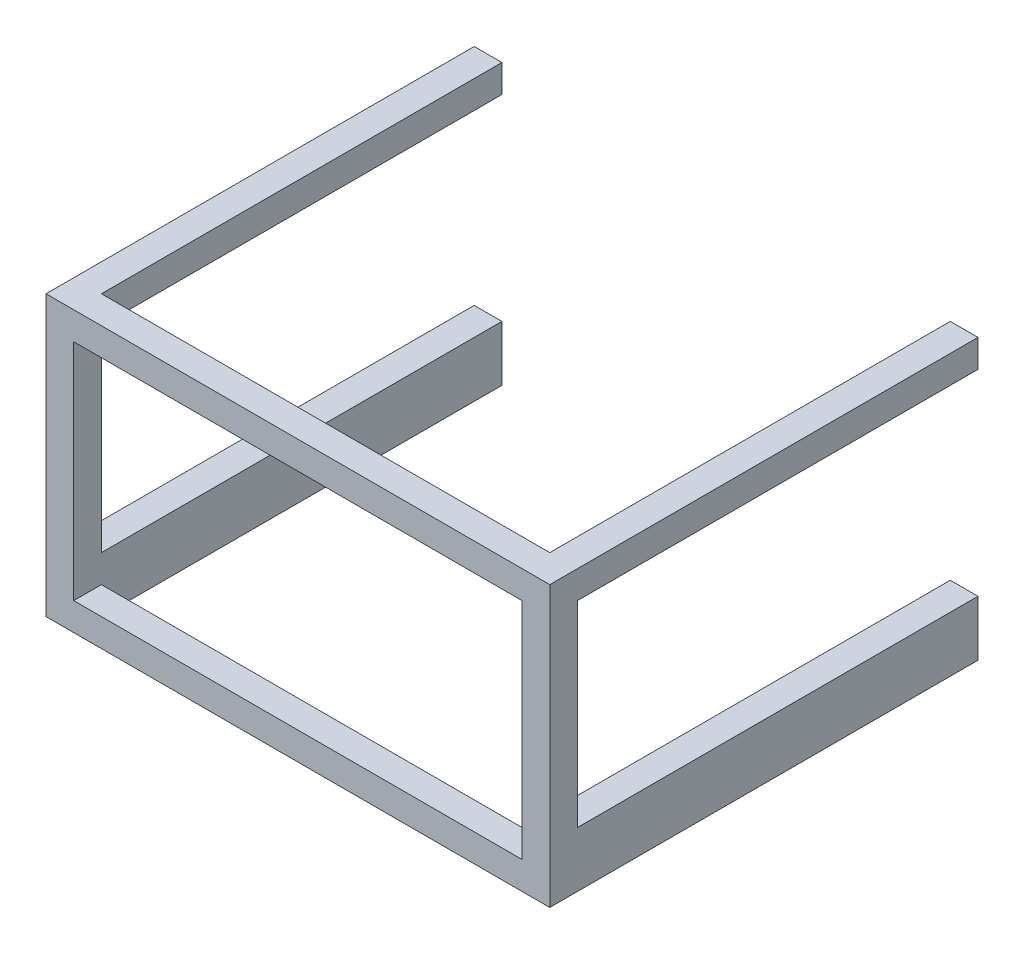
ISO-10303-21;
HEADER;
FILE_DESCRIPTION(('STEP AP214'),'2;1');
FILE_NAME('part.step','',(''),(''),'','','');
FILE_SCHEMA(('AUTOMOTIVE_DESIGN { 1 0 10303 214 1 1 1 1 }'));
ENDSEC;
DATA;
#1=APPLICATION_CONTEXT('core data for automotive mechanical design processes');
#2=APPLICATION_PROTOCOL_DEFINITION('international standard','automotive_design',2000,#1);
#3=PRODUCT_CONTEXT('',#1,'mechanical');
#4=PRODUCT('Part','Part','',(#3));
#5=PRODUCT_RELATED_PRODUCT_CATEGORY('part','',(#4));
#6=PRODUCT_DEFINITION_FORMATION('','',#4);
#7=PRODUCT_DEFINITION_CONTEXT('part definition',#1,'design');
#8=PRODUCT_DEFINITION('design','',#6,#7);
#9=PRODUCT_DEFINITION_SHAPE('','',#8);
#10=(LENGTH_UNIT() NAMED_UNIT(*) SI_UNIT(.MILLI.,.METRE.));
#11=(NAMED_UNIT(*) PLANE_ANGLE_UNIT() SI_UNIT($,.RADIAN.));
#12=(NAMED_UNIT(*) SI_UNIT($,.STERADIAN.) SOLID_ANGLE_UNIT());
#13=UNCERTAINTY_MEASURE_WITH_UNIT(LENGTH_MEASURE(1.E-05),#10,'distance_accuracy_value','');
#14=(GEOMETRIC_REPRESENTATION_CONTEXT(3) GLOBAL_UNCERTAINTY_ASSIGNED_CONTEXT((#13)) GLOBAL_UNIT_ASSIGNED_CONTEXT((#10,
#11,#12)) REPRESENTATION_CONTEXT('',''));
#15=CARTESIAN_POINT('',(0.,0.,0.));
#16=DIRECTION('',(0.,0.,1.));
#17=DIRECTION('',(1.,0.,0.));
#18=AXIS2_PLACEMENT_3D('',#15,#16,#17);
#19=CARTESIAN_POINT('',(-158.07662835249,91.5708812260537,318.));
#20=DIRECTION('',(0.,0.,1.));
#21=DIRECTION('',(1.,0.,0.));
#22=AXIS2_PLACEMENT_3D('',#19,#20,#21);
#23=PLANE('',#22);
#24=DIRECTION('',(1.,0.,0.));
#25=VECTOR('',#24,1.);
#26=CARTESIAN_POINT('',(-180.07662835249,69.5708812260536,318.));
#27=LINE('',#26,#25);
#28=CARTESIAN_POINT('',(-180.07662835249,69.5708812260536,318.));
#29=VERTEX_POINT('',#28);
#30=CARTESIAN_POINT('',(-158.07662835249,69.5708812260536,318.));
#31=VERTEX_POINT('',#30);
#32=EDGE_CURVE('E217',#29,#31,#27,.T.);
#33=ORIENTED_EDGE('',*,*,#32,.T.);
#34=DIRECTION('',(0.,-1.,0.));
#35=VECTOR('',#34,1.);
#36=CARTESIAN_POINT('',(-158.07662835249,91.5708812260537,318.));
#37=LINE('',#36,#35);
#38=CARTESIAN_POINT('',(-158.07662835249,-86.4291187739464,318.));
#39=VERTEX_POINT('',#38);
#40=EDGE_CURVE('E190',#31,#39,#37,.T.);
#41=ORIENTED_EDGE('',*,*,#40,.T.);
#42=DIRECTION('',(1.,0.,0.));
#43=VECTOR('',#42,1.);
#44=CARTESIAN_POINT('',(-180.07662835249,-86.4291187739464,318.));
#45=LINE('',#44,#43);
#46=CARTESIAN_POINT('',(-180.07662835249,-86.4291187739464,318.));
#47=VERTEX_POINT('',#46);
#48=EDGE_CURVE('E229',#47,#39,#45,.T.);
#49=ORIENTED_EDGE('',*,*,#48,.F.);
#50=DIRECTION('',(0.,-1.,0.));
#51=VECTOR('',#50,1.);
#52=CARTESIAN_POINT('',(-180.07662835249,69.5708812260536,318.));
#53=LINE('',#52,#51);
#54=EDGE_CURVE('E200',#29,#47,#53,.T.);
#55=ORIENTED_EDGE('',*,*,#54,.F.);
#56=EDGE_LOOP('',(#33,#41,#49,#55));
#57=FACE_BOUND('',#56,.T.);
#58=ADVANCED_FACE('F33',(#57),#23,.F.);
#59=DIRECTION('',(0.,-1.,0.));
#60=VECTOR('',#59,1.);
#61=CARTESIAN_POINT('',(197.92337164751,91.5708812260537,318.));
#62=LINE('',#61,#60);
#63=CARTESIAN_POINT('',(197.92337164751,91.5708812260537,318.));
#64=VERTEX_POINT('',#63);
#65=CARTESIAN_POINT('',(197.92337164751,69.5708812260536,318.));
#66=VERTEX_POINT('',#65);
#67=EDGE_CURVE('E260',#64,#66,#62,.T.);
#68=ORIENTED_EDGE('',*,*,#67,.T.);
#69=DIRECTION('',(-1.,0.,0.));
#70=VECTOR('',#69,1.);
#71=CARTESIAN_POINT('',(-158.07662835249,69.5708812260536,318.));
#72=LINE('',#71,#70);
#73=EDGE_CURVE('E11',#66,#31,#72,.T.);
#74=ORIENTED_EDGE('',*,*,#73,.T.);
#75=DIRECTION('',(0.,-1.,0.));
#76=VECTOR('',#75,1.);
#77=CARTESIAN_POINT('',(-158.07662835249,91.5708812260537,318.));
#78=LINE('',#77,#76);
#79=CARTESIAN_POINT('',(-158.07662835249,91.5708812260537,318.));
#80=VERTEX_POINT('',#79);
#81=EDGE_CURVE('E255',#80,#31,#78,.T.);
#82=ORIENTED_EDGE('',*,*,#81,.F.);
#83=DIRECTION('',(-1.,0.,0.));
#84=VECTOR('',#83,1.);
#85=CARTESIAN_POINT('',(-158.07662835249,91.5708812260537,318.));
#86=LINE('',#85,#84);
#87=EDGE_CURVE('E245',#64,#80,#86,.T.);
#88=ORIENTED_EDGE('',*,*,#87,.F.);
#89=EDGE_LOOP('',(#68,#74,#82,#88));
#90=FACE_BOUND('',#89,.T.);
#91=ADVANCED_FACE('F317',(#90),#23,.F.);
#92=CARTESIAN_POINT('',(197.92337164751,-86.4291187739464,318.));
#93=VERTEX_POINT('',#92);
#94=CARTESIAN_POINT('',(219.92337164751,-86.4291187739464,318.));
#95=VERTEX_POINT('',#94);
#96=EDGE_CURVE('E210',#93,#95,#45,.T.);
#97=ORIENTED_EDGE('',*,*,#96,.F.);
#98=DIRECTION('',(0.,1.,0.));
#99=VECTOR('',#98,1.);
#100=CARTESIAN_POINT('',(197.92337164751,91.5708812260537,318.));
#101=LINE('',#100,#99);
#102=EDGE_CURVE('E194',#93,#66,#101,.T.);
#103=ORIENTED_EDGE('',*,*,#102,.T.);
#104=CARTESIAN_POINT('',(219.92337164751,69.5708812260536,318.));
#105=VERTEX_POINT('',#104);
#106=EDGE_CURVE('E221',#66,#105,#27,.T.);
#107=ORIENTED_EDGE('',*,*,#106,.T.);
#108=DIRECTION('',(0.,-1.,0.));
#109=VECTOR('',#108,1.);
#110=CARTESIAN_POINT('',(219.92337164751,69.5708812260536,318.));
#111=LINE('',#110,#109);
#112=EDGE_CURVE('E199',#105,#95,#111,.T.);
#113=ORIENTED_EDGE('',*,*,#112,.T.);
#114=EDGE_LOOP('',(#97,#103,#107,#113));
#115=FACE_BOUND('',#114,.T.);
#116=ADVANCED_FACE('F335',(#115),#23,.F.);
#117=CARTESIAN_POINT('',(0.,0.,0.));
#118=DIRECTION('',(0.,0.,1.));
#119=DIRECTION('',(1.,0.,0.));
#120=AXIS2_PLACEMENT_3D('',#117,#118,#119);
#121=PLANE('',#120);
#122=DIRECTION('',(0.,-1.,0.));
#123=VECTOR('',#122,1.);
#124=CARTESIAN_POINT('',(-158.07662835249,91.5708812260537,0.));
#125=LINE('',#124,#123);
#126=CARTESIAN_POINT('',(-158.07662835249,91.5708812260537,0.));
#127=VERTEX_POINT('',#126);
#128=CARTESIAN_POINT('',(-158.07662835249,69.5708812260536,0.));
#129=VERTEX_POINT('',#128);
#130=EDGE_CURVE('E267',#127,#129,#125,.T.);
#131=ORIENTED_EDGE('',*,*,#130,.T.);
#132=DIRECTION('',(1.,0.,0.));
#133=VECTOR('',#132,1.);
#134=CARTESIAN_POINT('',(-180.07662835249,69.5708812260536,0.));
#135=LINE('',#134,#133);
#136=CARTESIAN_POINT('',(-180.07662835249,69.5708812260536,0.));
#137=VERTEX_POINT('',#136);
#138=EDGE_CURVE('E222',#137,#129,#135,.T.);
#139=ORIENTED_EDGE('',*,*,#138,.F.);
#140=DIRECTION('',(0.,-1.,0.));
#141=VECTOR('',#140,1.);
#142=CARTESIAN_POINT('',(-180.07662835249,91.5708812260537,0.));
#143=LINE('',#142,#141);
#144=CARTESIAN_POINT('',(-180.07662835249,91.5708812260537,0.));
#145=VERTEX_POINT('',#144);
#146=EDGE_CURVE('E281',#145,#137,#143,.T.);
#147=ORIENTED_EDGE('',*,*,#146,.F.);
#148=DIRECTION('',(-1.,0.,0.));
#149=VECTOR('',#148,1.);
#150=CARTESIAN_POINT('',(-180.07662835249,91.5708812260537,0.));
#151=LINE('',#150,#149);
#152=EDGE_CURVE('E292',#127,#145,#151,.T.);
#153=ORIENTED_EDGE('',*,*,#152,.F.);
#154=EDGE_LOOP('',(#131,#139,#147,#153));
#155=FACE_BOUND('',#154,.T.);
#156=ADVANCED_FACE('F394',(#155),#121,.F.);
#157=DIRECTION('',(0.,1.,0.));
#158=VECTOR('',#157,1.);
#159=CARTESIAN_POINT('',(219.92337164751,91.5708812260537,0.));
#160=LINE('',#159,#158);
#161=CARTESIAN_POINT('',(219.92337164751,69.5708812260536,0.));
#162=VERTEX_POINT('',#161);
#163=CARTESIAN_POINT('',(219.92337164751,91.5708812260537,0.));
#164=VERTEX_POINT('',#163);
#165=EDGE_CURVE('E288',#162,#164,#160,.T.);
#166=ORIENTED_EDGE('',*,*,#165,.F.);
#167=CARTESIAN_POINT('',(197.92337164751,69.5708812260536,0.));
#168=VERTEX_POINT('',#167);
#169=EDGE_CURVE('E224',#168,#162,#135,.T.);
#170=ORIENTED_EDGE('',*,*,#169,.F.);
#171=DIRECTION('',(0.,-1.,0.));
#172=VECTOR('',#171,1.);
#173=CARTESIAN_POINT('',(197.92337164751,91.5708812260537,0.));
#174=LINE('',#173,#172);
#175=CARTESIAN_POINT('',(197.92337164751,91.5708812260537,0.));
#176=VERTEX_POINT('',#175);
#177=EDGE_CURVE('E263',#176,#168,#174,.T.);
#178=ORIENTED_EDGE('',*,*,#177,.F.);
#179=EDGE_CURVE('E274',#164,#176,#151,.T.);
#180=ORIENTED_EDGE('',*,*,#179,.F.);
#181=EDGE_LOOP('',(#166,#170,#178,#180));
#182=FACE_BOUND('',#181,.T.);
#183=ADVANCED_FACE('F325',(#182),#121,.F.);
#184=CARTESIAN_POINT('',(-158.07662835249,91.5708812260537,318.));
#185=DIRECTION('',(-1.,0.,0.));
#186=DIRECTION('',(0.,0.,1.));
#187=AXIS2_PLACEMENT_3D('',#184,#185,#186);
#188=PLANE('',#187);
#189=ORIENTED_EDGE('',*,*,#81,.T.);
#190=DIRECTION('',(0.,0.,-1.));
#191=VECTOR('',#190,1.);
#192=CARTESIAN_POINT('',(-158.07662835249,69.5708812260536,318.));
#193=LINE('',#192,#191);
#194=EDGE_CURVE('E234',#31,#129,#193,.T.);
#195=ORIENTED_EDGE('',*,*,#194,.T.);
#196=ORIENTED_EDGE('',*,*,#130,.F.);
#197=DIRECTION('',(0.,0.,-1.));
#198=VECTOR('',#197,1.);
#199=CARTESIAN_POINT('',(-158.07662835249,91.5708812260537,318.));
#200=LINE('',#199,#198);
#201=EDGE_CURVE('E238',#80,#127,#200,.T.);
#202=ORIENTED_EDGE('',*,*,#201,.F.);
#203=EDGE_LOOP('',(#189,#195,#196,#202));
#204=FACE_BOUND('',#203,.T.);
#205=ADVANCED_FACE('F392',(#204),#188,.F.);
#206=CARTESIAN_POINT('',(197.92337164751,91.5708812260537,318.));
#207=DIRECTION('',(1.,0.,0.));
#208=DIRECTION('',(0.,0.,-1.));
#209=AXIS2_PLACEMENT_3D('',#206,#207,#208);
#210=PLANE('',#209);
#211=ORIENTED_EDGE('',*,*,#177,.T.);
#212=DIRECTION('',(0.,0.,1.));
#213=VECTOR('',#212,1.);
#214=CARTESIAN_POINT('',(197.92337164751,69.5708812260536,318.));
#215=LINE('',#214,#213);
#216=EDGE_CURVE('E41',#168,#66,#215,.T.);
#217=ORIENTED_EDGE('',*,*,#216,.T.);
#218=ORIENTED_EDGE('',*,*,#67,.F.);
#219=DIRECTION('',(0.,0.,1.));
#220=VECTOR('',#219,1.);
#221=CARTESIAN_POINT('',(197.92337164751,91.5708812260537,318.));
#222=LINE('',#221,#220);
#223=EDGE_CURVE('E241',#176,#64,#222,.T.);
#224=ORIENTED_EDGE('',*,*,#223,.F.);
#225=EDGE_LOOP('',(#211,#217,#218,#224));
#226=FACE_BOUND('',#225,.T.);
#227=ADVANCED_FACE('F310',(#226),#210,.F.);
#228=CARTESIAN_POINT('',(-180.07662835249,-86.4291187739464,0.));
#229=VERTEX_POINT('',#228);
#230=CARTESIAN_POINT('',(-180.07662835249,-130.429118773946,0.));
#231=VERTEX_POINT('',#230);
#232=EDGE_CURVE('E258',#229,#231,#143,.T.);
#233=ORIENTED_EDGE('',*,*,#232,.F.);
#234=DIRECTION('',(1.,0.,0.));
#235=VECTOR('',#234,1.);
#236=CARTESIAN_POINT('',(-180.07662835249,-86.4291187739464,0.));
#237=LINE('',#236,#235);
#238=CARTESIAN_POINT('',(-158.07662835249,-86.4291187739464,0.));
#239=VERTEX_POINT('',#238);
#240=EDGE_CURVE('E225',#229,#239,#237,.T.);
#241=ORIENTED_EDGE('',*,*,#240,.T.);
#242=CARTESIAN_POINT('',(-158.07662835249,-130.429118773946,0.));
#243=VERTEX_POINT('',#242);
#244=EDGE_CURVE('E248',#239,#243,#125,.T.);
#245=ORIENTED_EDGE('',*,*,#244,.T.);
#246=DIRECTION('',(1.,0.,0.));
#247=VECTOR('',#246,1.);
#248=CARTESIAN_POINT('',(-180.07662835249,-130.429118773946,0.));
#249=LINE('',#248,#247);
#250=EDGE_CURVE('E285',#231,#243,#249,.T.);
#251=ORIENTED_EDGE('',*,*,#250,.F.);
#252=EDGE_LOOP('',(#233,#241,#245,#251));
#253=FACE_BOUND('',#252,.T.);
#254=ADVANCED_FACE('F361',(#253),#121,.F.);
#255=CARTESIAN_POINT('',(-180.07662835249,91.5708812260537,340.));
#256=DIRECTION('',(1.,0.,0.));
#257=DIRECTION('',(0.,0.,-1.));
#258=AXIS2_PLACEMENT_3D('',#255,#256,#257);
#259=PLANE('',#258);
#260=ORIENTED_EDGE('',*,*,#146,.T.);
#261=DIRECTION('',(0.,0.,1.));
#262=VECTOR('',#261,1.);
#263=CARTESIAN_POINT('',(-180.07662835249,69.5708812260536,318.));
#264=LINE('',#263,#262);
#265=EDGE_CURVE('E207',#137,#29,#264,.T.);
#266=ORIENTED_EDGE('',*,*,#265,.T.);
#267=ORIENTED_EDGE('',*,*,#54,.T.);
#268=DIRECTION('',(0.,0.,-1.));
#269=VECTOR('',#268,1.);
#270=CARTESIAN_POINT('',(-180.07662835249,-86.4291187739464,318.));
#271=LINE('',#270,#269);
#272=EDGE_CURVE('E203',#47,#229,#271,.T.);
#273=ORIENTED_EDGE('',*,*,#272,.T.);
#274=ORIENTED_EDGE('',*,*,#232,.T.);
#275=DIRECTION('',(0.,0.,-1.));
#276=VECTOR('',#275,1.);
#277=CARTESIAN_POINT('',(-180.07662835249,-130.429118773946,340.));
#278=LINE('',#277,#276);
#279=CARTESIAN_POINT('',(-180.07662835249,-130.429118773946,340.));
#280=VERTEX_POINT('',#279);
#281=EDGE_CURVE('E303',#280,#231,#278,.T.);
#282=ORIENTED_EDGE('',*,*,#281,.F.);
#283=DIRECTION('',(0.,-1.,0.));
#284=VECTOR('',#283,1.);
#285=CARTESIAN_POINT('',(-180.07662835249,91.5708812260537,340.));
#286=LINE('',#285,#284);
#287=CARTESIAN_POINT('',(-180.07662835249,91.5708812260537,340.));
#288=VERTEX_POINT('',#287);
#289=EDGE_CURVE('E270',#288,#280,#286,.T.);
#290=ORIENTED_EDGE('',*,*,#289,.F.);
#291=DIRECTION('',(0.,0.,-1.));
#292=VECTOR('',#291,1.);
#293=CARTESIAN_POINT('',(-180.07662835249,91.5708812260537,340.));
#294=LINE('',#293,#292);
#295=EDGE_CURVE('E280',#288,#145,#294,.T.);
#296=ORIENTED_EDGE('',*,*,#295,.T.);
#297=EDGE_LOOP('',(#260,#266,#267,#273,#274,#282,#290,#296));
#298=FACE_BOUND('',#297,.T.);
#299=ADVANCED_FACE('F35',(#298),#259,.F.);
#300=CARTESIAN_POINT('',(-180.07662835249,-130.429118773946,340.));
#301=DIRECTION('',(0.,1.,0.));
#302=DIRECTION('',(0.,0.,1.));
#303=AXIS2_PLACEMENT_3D('',#300,#301,#302);
#304=PLANE('',#303);
#305=ORIENTED_EDGE('',*,*,#250,.T.);
#306=DIRECTION('',(0.,0.,-1.));
#307=VECTOR('',#306,1.);
#308=CARTESIAN_POINT('',(-158.07662835249,-130.429118773946,318.));
#309=LINE('',#308,#307);
#310=CARTESIAN_POINT('',(-158.07662835249,-130.429118773946,318.));
#311=VERTEX_POINT('',#310);
#312=EDGE_CURVE('E237',#311,#243,#309,.T.);
#313=ORIENTED_EDGE('',*,*,#312,.F.);
#314=DIRECTION('',(-1.,0.,0.));
#315=VECTOR('',#314,1.);
#316=CARTESIAN_POINT('',(-158.07662835249,-130.429118773946,318.));
#317=LINE('',#316,#315);
#318=CARTESIAN_POINT('',(197.92337164751,-130.429118773946,318.));
#319=VERTEX_POINT('',#318);
#320=EDGE_CURVE('E242',#319,#311,#317,.T.);
#321=ORIENTED_EDGE('',*,*,#320,.F.);
#322=DIRECTION('',(0.,0.,1.));
#323=VECTOR('',#322,1.);
#324=CARTESIAN_POINT('',(197.92337164751,-130.429118773946,318.));
#325=LINE('',#324,#323);
#326=CARTESIAN_POINT('',(197.92337164751,-130.429118773946,0.));
#327=VERTEX_POINT('',#326);
#328=EDGE_CURVE('E251',#327,#319,#325,.T.);
#329=ORIENTED_EDGE('',*,*,#328,.F.);
#330=CARTESIAN_POINT('',(219.92337164751,-130.429118773946,0.));
#331=VERTEX_POINT('',#330);
#332=EDGE_CURVE('E284',#327,#331,#249,.T.);
#333=ORIENTED_EDGE('',*,*,#332,.T.);
#334=DIRECTION('',(0.,0.,-1.));
#335=VECTOR('',#334,1.);
#336=CARTESIAN_POINT('',(219.92337164751,-130.429118773946,340.));
#337=LINE('',#336,#335);
#338=CARTESIAN_POINT('',(219.92337164751,-130.429118773946,340.));
#339=VERTEX_POINT('',#338);
#340=EDGE_CURVE('E300',#339,#331,#337,.T.);
#341=ORIENTED_EDGE('',*,*,#340,.F.);
#342=DIRECTION('',(1.,0.,0.));
#343=VECTOR('',#342,1.);
#344=CARTESIAN_POINT('',(-180.07662835249,-130.429118773946,340.));
#345=LINE('',#344,#343);
#346=EDGE_CURVE('E273',#280,#339,#345,.T.);
#347=ORIENTED_EDGE('',*,*,#346,.F.);
#348=ORIENTED_EDGE('',*,*,#281,.T.);
#349=EDGE_LOOP('',(#305,#313,#321,#329,#333,#341,#347,#348));
#350=FACE_BOUND('',#349,.T.);
#351=ADVANCED_FACE('F348',(#350),#304,.F.);
#352=CARTESIAN_POINT('',(219.92337164751,91.5708812260537,340.));
#353=DIRECTION('',(-1.,0.,0.));
#354=DIRECTION('',(0.,-1.,0.));
#355=AXIS2_PLACEMENT_3D('',#352,#353,#354);
#356=PLANE('',#355);
#357=ORIENTED_EDGE('',*,*,#112,.F.);
#358=DIRECTION('',(0.,0.,1.));
#359=VECTOR('',#358,1.);
#360=CARTESIAN_POINT('',(219.92337164751,69.5708812260536,318.));
#361=LINE('',#360,#359);
#362=EDGE_CURVE('E204',#162,#105,#361,.T.);
#363=ORIENTED_EDGE('',*,*,#362,.F.);
#364=ORIENTED_EDGE('',*,*,#165,.T.);
#365=DIRECTION('',(0.,0.,-1.));
#366=VECTOR('',#365,1.);
#367=CARTESIAN_POINT('',(219.92337164751,91.5708812260537,340.));
#368=LINE('',#367,#366);
#369=CARTESIAN_POINT('',(219.92337164751,91.5708812260537,340.));
#370=VERTEX_POINT('',#369);
#371=EDGE_CURVE('E297',#370,#164,#368,.T.);
#372=ORIENTED_EDGE('',*,*,#371,.F.);
#373=DIRECTION('',(0.,1.,0.));
#374=VECTOR('',#373,1.);
#375=CARTESIAN_POINT('',(219.92337164751,91.5708812260537,340.));
#376=LINE('',#375,#374);
#377=EDGE_CURVE('E276',#339,#370,#376,.T.);
#378=ORIENTED_EDGE('',*,*,#377,.F.);
#379=ORIENTED_EDGE('',*,*,#340,.T.);
#380=CARTESIAN_POINT('',(219.92337164751,-86.4291187739464,0.));
#381=VERTEX_POINT('',#380);
#382=EDGE_CURVE('E289',#331,#381,#160,.T.);
#383=ORIENTED_EDGE('',*,*,#382,.T.);
#384=DIRECTION('',(0.,0.,-1.));
#385=VECTOR('',#384,1.);
#386=CARTESIAN_POINT('',(219.92337164751,-86.4291187739464,318.));
#387=LINE('',#386,#385);
#388=EDGE_CURVE('E213',#95,#381,#387,.T.);
#389=ORIENTED_EDGE('',*,*,#388,.F.);
#390=EDGE_LOOP('',(#357,#363,#364,#372,#378,#379,#383,#389));
#391=FACE_BOUND('',#390,.T.);
#392=ADVANCED_FACE('F330',(#391),#356,.F.);
#393=CARTESIAN_POINT('',(-180.07662835249,91.5708812260537,340.));
#394=DIRECTION('',(0.,-1.,0.));
#395=DIRECTION('',(0.,0.,-1.));
#396=AXIS2_PLACEMENT_3D('',#393,#394,#395);
#397=PLANE('',#396);
#398=ORIENTED_EDGE('',*,*,#87,.T.);
#399=ORIENTED_EDGE('',*,*,#201,.T.);
#400=ORIENTED_EDGE('',*,*,#152,.T.);
#401=ORIENTED_EDGE('',*,*,#295,.F.);
#402=DIRECTION('',(-1.,0.,0.));
#403=VECTOR('',#402,1.);
#404=CARTESIAN_POINT('',(-180.07662835249,91.5708812260537,340.));
#405=LINE('',#404,#403);
#406=EDGE_CURVE('E278',#370,#288,#405,.T.);
#407=ORIENTED_EDGE('',*,*,#406,.F.);
#408=ORIENTED_EDGE('',*,*,#371,.T.);
#409=ORIENTED_EDGE('',*,*,#179,.T.);
#410=ORIENTED_EDGE('',*,*,#223,.T.);
#411=EDGE_LOOP('',(#398,#399,#400,#401,#407,#408,#409,#410));
#412=FACE_BOUND('',#411,.T.);
#413=ADVANCED_FACE('F321',(#412),#397,.F.);
#414=CARTESIAN_POINT('',(0.,0.,340.));
#415=DIRECTION('',(0.,0.,1.));
#416=DIRECTION('',(1.,0.,0.));
#417=AXIS2_PLACEMENT_3D('',#414,#415,#416);
#418=PLANE('',#417);
#419=DIRECTION('',(0.,-1.,0.));
#420=VECTOR('',#419,1.);
#421=CARTESIAN_POINT('',(-158.07662835249,69.5708812260536,340.));
#422=LINE('',#421,#420);
#423=CARTESIAN_POINT('',(-158.07662835249,69.5708812260536,340.));
#424=VERTEX_POINT('',#423);
#425=CARTESIAN_POINT('',(-158.07662835249,-108.429118773946,340.));
#426=VERTEX_POINT('',#425);
#427=EDGE_CURVE('E48',#424,#426,#422,.T.);
#428=ORIENTED_EDGE('',*,*,#427,.F.);
#429=DIRECTION('',(-1.,0.,0.));
#430=VECTOR('',#429,1.);
#431=CARTESIAN_POINT('',(-158.07662835249,69.5708812260536,340.));
#432=LINE('',#431,#430);
#433=CARTESIAN_POINT('',(197.92337164751,69.5708812260536,340.));
#434=VERTEX_POINT('',#433);
#435=EDGE_CURVE('E183',#434,#424,#432,.T.);
#436=ORIENTED_EDGE('',*,*,#435,.F.);
#437=DIRECTION('',(0.,1.,0.));
#438=VECTOR('',#437,1.);
#439=CARTESIAN_POINT('',(197.92337164751,69.5708812260536,340.));
#440=LINE('',#439,#438);
#441=CARTESIAN_POINT('',(197.92337164751,-108.429118773946,340.));
#442=VERTEX_POINT('',#441);
#443=EDGE_CURVE('E168',#442,#434,#440,.T.);
#444=ORIENTED_EDGE('',*,*,#443,.F.);
#445=DIRECTION('',(1.,0.,0.));
#446=VECTOR('',#445,1.);
#447=CARTESIAN_POINT('',(-158.07662835249,-108.429118773946,340.));
#448=LINE('',#447,#446);
#449=EDGE_CURVE('E176',#426,#442,#448,.T.);
#450=ORIENTED_EDGE('',*,*,#449,.F.);
#451=EDGE_LOOP('',(#428,#436,#444,#450));
#452=FACE_BOUND('',#451,.T.);
#453=ORIENTED_EDGE('',*,*,#289,.T.);
#454=ORIENTED_EDGE('',*,*,#346,.T.);
#455=ORIENTED_EDGE('',*,*,#377,.T.);
#456=ORIENTED_EDGE('',*,*,#406,.T.);
#457=EDGE_LOOP('',(#453,#454,#455,#456));
#458=FACE_BOUND('',#457,.T.);
#459=ADVANCED_FACE('F180',(#452,#458),#418,.T.);
#460=CARTESIAN_POINT('',(197.92337164751,-86.4291187739464,0.));
#461=VERTEX_POINT('',#460);
#462=EDGE_CURVE('E266',#461,#327,#174,.T.);
#463=ORIENTED_EDGE('',*,*,#462,.F.);
#464=EDGE_CURVE('E228',#461,#381,#237,.T.);
#465=ORIENTED_EDGE('',*,*,#464,.T.);
#466=ORIENTED_EDGE('',*,*,#382,.F.);
#467=ORIENTED_EDGE('',*,*,#332,.F.);
#468=EDGE_LOOP('',(#463,#465,#466,#467));
#469=FACE_BOUND('',#468,.T.);
#470=ADVANCED_FACE('F343',(#469),#121,.F.);
#471=ORIENTED_EDGE('',*,*,#312,.T.);
#472=ORIENTED_EDGE('',*,*,#244,.F.);
#473=DIRECTION('',(0.,0.,1.));
#474=VECTOR('',#473,1.);
#475=CARTESIAN_POINT('',(-158.07662835249,-86.4291187739464,318.));
#476=LINE('',#475,#474);
#477=EDGE_CURVE('E220',#239,#39,#476,.T.);
#478=ORIENTED_EDGE('',*,*,#477,.T.);
#479=ORIENTED_EDGE('',*,*,#40,.F.);
#480=DIRECTION('',(0.,0.,1.));
#481=VECTOR('',#480,1.);
#482=CARTESIAN_POINT('',(-158.07662835249,69.5708812260536,0.));
#483=LINE('',#482,#481);
#484=EDGE_CURVE('E188',#31,#424,#483,.T.);
#485=ORIENTED_EDGE('',*,*,#484,.T.);
#486=ORIENTED_EDGE('',*,*,#427,.T.);
#487=DIRECTION('',(0.,0.,1.));
#488=VECTOR('',#487,1.);
#489=CARTESIAN_POINT('',(-158.07662835249,-108.429118773946,0.));
#490=LINE('',#489,#488);
#491=CARTESIAN_POINT('',(-158.07662835249,-108.429118773946,318.));
#492=VERTEX_POINT('',#491);
#493=EDGE_CURVE('E173',#492,#426,#490,.T.);
#494=ORIENTED_EDGE('',*,*,#493,.F.);
#495=EDGE_CURVE('E259',#492,#311,#78,.T.);
#496=ORIENTED_EDGE('',*,*,#495,.T.);
#497=EDGE_LOOP('',(#471,#472,#478,#479,#485,#486,#494,#496));
#498=FACE_BOUND('',#497,.T.);
#499=ADVANCED_FACE('F355',(#498),#188,.F.);
#500=ORIENTED_EDGE('',*,*,#495,.F.);
#501=DIRECTION('',(1.,0.,0.));
#502=VECTOR('',#501,1.);
#503=CARTESIAN_POINT('',(-158.07662835249,-108.429118773946,318.));
#504=LINE('',#503,#502);
#505=CARTESIAN_POINT('',(197.92337164751,-108.429118773946,318.));
#506=VERTEX_POINT('',#505);
#507=EDGE_CURVE('E197',#492,#506,#504,.T.);
#508=ORIENTED_EDGE('',*,*,#507,.T.);
#509=EDGE_CURVE('E171',#506,#319,#62,.T.);
#510=ORIENTED_EDGE('',*,*,#509,.T.);
#511=ORIENTED_EDGE('',*,*,#320,.T.);
#512=EDGE_LOOP('',(#500,#508,#510,#511));
#513=FACE_BOUND('',#512,.T.);
#514=ADVANCED_FACE('F354',(#513),#23,.F.);
#515=ORIENTED_EDGE('',*,*,#509,.F.);
#516=DIRECTION('',(0.,0.,1.));
#517=VECTOR('',#516,1.);
#518=CARTESIAN_POINT('',(197.92337164751,-108.429118773946,0.));
#519=LINE('',#518,#517);
#520=EDGE_CURVE('E56',#506,#442,#519,.T.);
#521=ORIENTED_EDGE('',*,*,#520,.T.);
#522=ORIENTED_EDGE('',*,*,#443,.T.);
#523=DIRECTION('',(0.,0.,1.));
#524=VECTOR('',#523,1.);
#525=CARTESIAN_POINT('',(197.92337164751,69.5708812260536,0.));
#526=LINE('',#525,#524);
#527=EDGE_CURVE('E172',#66,#434,#526,.T.);
#528=ORIENTED_EDGE('',*,*,#527,.F.);
#529=ORIENTED_EDGE('',*,*,#102,.F.);
#530=DIRECTION('',(0.,0.,-1.));
#531=VECTOR('',#530,1.);
#532=CARTESIAN_POINT('',(197.92337164751,-86.4291187739464,318.));
#533=LINE('',#532,#531);
#534=EDGE_CURVE('E306',#93,#461,#533,.T.);
#535=ORIENTED_EDGE('',*,*,#534,.T.);
#536=ORIENTED_EDGE('',*,*,#462,.T.);
#537=ORIENTED_EDGE('',*,*,#328,.T.);
#538=EDGE_LOOP('',(#515,#521,#522,#528,#529,#535,#536,#537));
#539=FACE_BOUND('',#538,.T.);
#540=ADVANCED_FACE('F165',(#539),#210,.F.);
#541=CARTESIAN_POINT('',(-180.07662835249,-86.4291187739464,318.));
#542=DIRECTION('',(0.,-1.,0.));
#543=DIRECTION('',(1.,0.,0.));
#544=AXIS2_PLACEMENT_3D('',#541,#542,#543);
#545=PLANE('',#544);
#546=ORIENTED_EDGE('',*,*,#96,.T.);
#547=ORIENTED_EDGE('',*,*,#388,.T.);
#548=ORIENTED_EDGE('',*,*,#464,.F.);
#549=ORIENTED_EDGE('',*,*,#534,.F.);
#550=EDGE_LOOP('',(#546,#547,#548,#549));
#551=FACE_BOUND('',#550,.T.);
#552=ADVANCED_FACE('F339',(#551),#545,.F.);
#553=CARTESIAN_POINT('',(-180.07662835249,69.5708812260536,318.));
#554=DIRECTION('',(0.,1.,0.));
#555=DIRECTION('',(-1.,0.,0.));
#556=AXIS2_PLACEMENT_3D('',#553,#554,#555);
#557=PLANE('',#556);
#558=ORIENTED_EDGE('',*,*,#169,.T.);
#559=ORIENTED_EDGE('',*,*,#362,.T.);
#560=ORIENTED_EDGE('',*,*,#106,.F.);
#561=ORIENTED_EDGE('',*,*,#216,.F.);
#562=EDGE_LOOP('',(#558,#559,#560,#561));
#563=FACE_BOUND('',#562,.T.);
#564=ADVANCED_FACE('F327',(#563),#557,.F.);
#565=ORIENTED_EDGE('',*,*,#32,.F.);
#566=ORIENTED_EDGE('',*,*,#265,.F.);
#567=ORIENTED_EDGE('',*,*,#138,.T.);
#568=ORIENTED_EDGE('',*,*,#194,.F.);
#569=EDGE_LOOP('',(#565,#566,#567,#568));
#570=FACE_BOUND('',#569,.T.);
#571=ADVANCED_FACE('F378',(#570),#557,.F.);
#572=ORIENTED_EDGE('',*,*,#240,.F.);
#573=ORIENTED_EDGE('',*,*,#272,.F.);
#574=ORIENTED_EDGE('',*,*,#48,.T.);
#575=ORIENTED_EDGE('',*,*,#477,.F.);
#576=EDGE_LOOP('',(#572,#573,#574,#575));
#577=FACE_BOUND('',#576,.T.);
#578=ADVANCED_FACE('F364',(#577),#545,.F.);
#579=CARTESIAN_POINT('',(-158.07662835249,69.5708812260536,0.));
#580=DIRECTION('',(0.,1.,0.));
#581=DIRECTION('',(0.,0.,1.));
#582=AXIS2_PLACEMENT_3D('',#579,#580,#581);
#583=PLANE('',#582);
#584=ORIENTED_EDGE('',*,*,#527,.T.);
#585=ORIENTED_EDGE('',*,*,#435,.T.);
#586=ORIENTED_EDGE('',*,*,#484,.F.);
#587=ORIENTED_EDGE('',*,*,#73,.F.);
#588=EDGE_LOOP('',(#584,#585,#586,#587));
#589=FACE_BOUND('',#588,.T.);
#590=ADVANCED_FACE('F370',(#589),#583,.F.);
#591=CARTESIAN_POINT('',(-158.07662835249,-108.429118773946,0.));
#592=DIRECTION('',(0.,-1.,0.));
#593=DIRECTION('',(0.,0.,-1.));
#594=AXIS2_PLACEMENT_3D('',#591,#592,#593);
#595=PLANE('',#594);
#596=ORIENTED_EDGE('',*,*,#493,.T.);
#597=ORIENTED_EDGE('',*,*,#449,.T.);
#598=ORIENTED_EDGE('',*,*,#520,.F.);
#599=ORIENTED_EDGE('',*,*,#507,.F.);
#600=EDGE_LOOP('',(#596,#597,#598,#599));
#601=FACE_BOUND('',#600,.T.);
#602=ADVANCED_FACE('F177',(#601),#595,.F.);
#603=CLOSED_SHELL('',(#58,#91,#116,#156,#183,#205,#227,#254,#299,#351,#392,#413,#459,#470,#499,
#514,#540,#552,#564,#571,#578,#590,#602));
#604=MANIFOLD_SOLID_BREP('B2',#603);
#605=ADVANCED_BREP_SHAPE_REPRESENTATION('',(#18,#604),#14);
#606=SHAPE_DEFINITION_REPRESENTATION(#9,#605);
ENDSEC;
END-ISO-10303-21;
